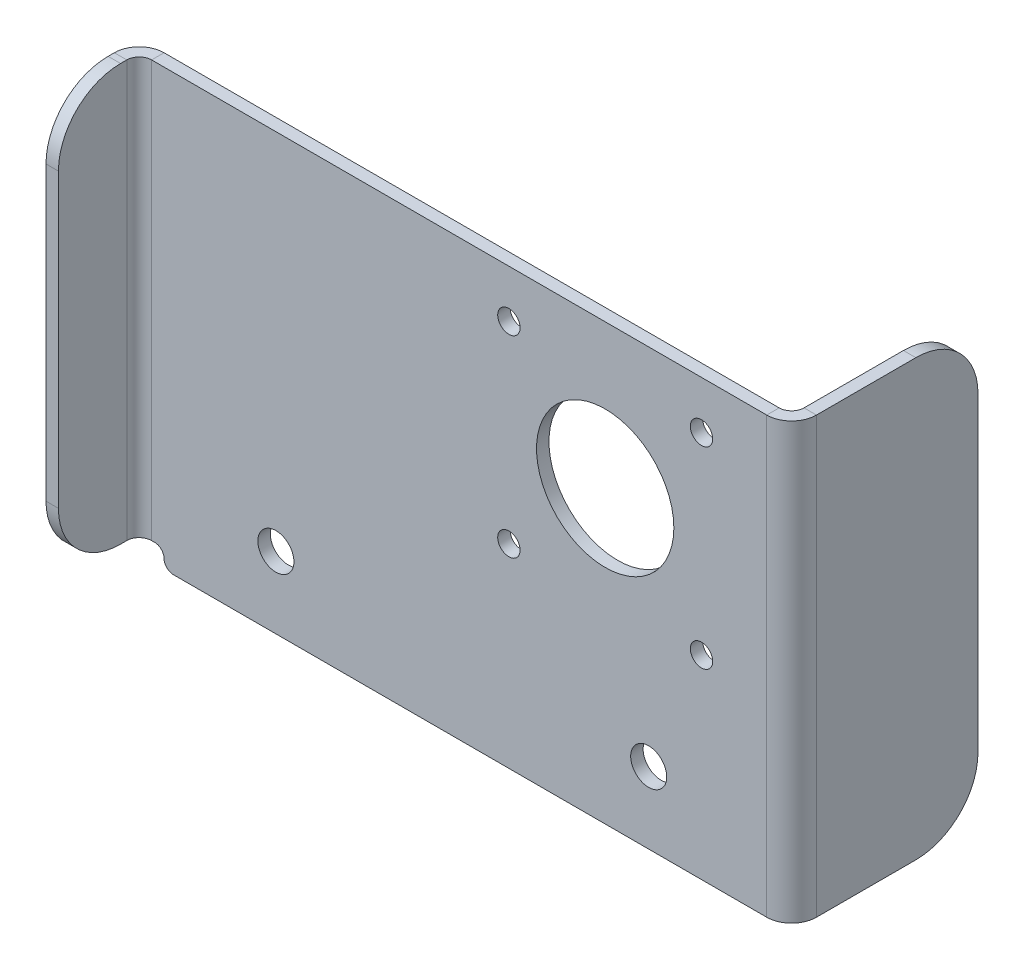
ISO-10303-21;
HEADER;
FILE_DESCRIPTION(('STEP AP214'),'2;1');
FILE_NAME('part.step','',(''),(''),'','','');
FILE_SCHEMA(('AUTOMOTIVE_DESIGN { 1 0 10303 214 1 1 1 1 }'));
ENDSEC;
DATA;
#1=APPLICATION_CONTEXT('core data for automotive mechanical design processes');
#2=APPLICATION_PROTOCOL_DEFINITION('international standard','automotive_design',2000,#1);
#3=PRODUCT_CONTEXT('',#1,'mechanical');
#4=PRODUCT('Part','Part','',(#3));
#5=PRODUCT_RELATED_PRODUCT_CATEGORY('part','',(#4));
#6=PRODUCT_DEFINITION_FORMATION('','',#4);
#7=PRODUCT_DEFINITION_CONTEXT('part definition',#1,'design');
#8=PRODUCT_DEFINITION('design','',#6,#7);
#9=PRODUCT_DEFINITION_SHAPE('','',#8);
#10=(LENGTH_UNIT() NAMED_UNIT(*) SI_UNIT(.MILLI.,.METRE.));
#11=(NAMED_UNIT(*) PLANE_ANGLE_UNIT() SI_UNIT($,.RADIAN.));
#12=(NAMED_UNIT(*) SI_UNIT($,.STERADIAN.) SOLID_ANGLE_UNIT());
#13=UNCERTAINTY_MEASURE_WITH_UNIT(LENGTH_MEASURE(1.E-05),#10,'distance_accuracy_value','');
#14=(GEOMETRIC_REPRESENTATION_CONTEXT(3) GLOBAL_UNCERTAINTY_ASSIGNED_CONTEXT((#13)) GLOBAL_UNIT_ASSIGNED_CONTEXT((#10,
#11,#12)) REPRESENTATION_CONTEXT('',''));
#15=CARTESIAN_POINT('',(0.,0.,0.));
#16=DIRECTION('',(0.,0.,1.));
#17=DIRECTION('',(1.,0.,0.));
#18=AXIS2_PLACEMENT_3D('',#15,#16,#17);
#19=CARTESIAN_POINT('',(-48.,-35.,-2.));
#20=DIRECTION('',(0.,-1.,0.));
#21=DIRECTION('',(0.,0.,-1.));
#22=AXIS2_PLACEMENT_3D('',#19,#20,#21);
#23=PLANE('',#22);
#24=DIRECTION('',(1.,0.,0.));
#25=VECTOR('',#24,1.);
#26=CARTESIAN_POINT('',(-48.,-35.,0.));
#27=LINE('',#26,#25);
#28=CARTESIAN_POINT('',(-46.5,-35.,0.));
#29=VERTEX_POINT('',#28);
#30=CARTESIAN_POINT('',(49.,-35.,0.));
#31=VERTEX_POINT('',#30);
#32=EDGE_CURVE('E442',#29,#31,#27,.T.);
#33=ORIENTED_EDGE('',*,*,#32,.F.);
#34=DIRECTION('',(0.,0.,1.));
#35=VECTOR('',#34,1.);
#36=CARTESIAN_POINT('',(-46.5,-35.,-2.));
#37=LINE('',#36,#35);
#38=CARTESIAN_POINT('',(-46.5,-35.,-2.));
#39=VERTEX_POINT('',#38);
#40=EDGE_CURVE('E111',#29,#39,#37,.F.);
#41=ORIENTED_EDGE('',*,*,#40,.T.);
#42=DIRECTION('',(1.,0.,0.));
#43=VECTOR('',#42,1.);
#44=CARTESIAN_POINT('',(-48.,-35.,-2.));
#45=LINE('',#44,#43);
#46=CARTESIAN_POINT('',(49.,-35.,-2.));
#47=VERTEX_POINT('',#46);
#48=EDGE_CURVE('E441',#39,#47,#45,.T.);
#49=ORIENTED_EDGE('',*,*,#48,.T.);
#50=DIRECTION('',(0.,0.,1.));
#51=VECTOR('',#50,1.);
#52=CARTESIAN_POINT('',(49.,-35.,-2.));
#53=LINE('',#52,#51);
#54=EDGE_CURVE('E288',#47,#31,#53,.T.);
#55=ORIENTED_EDGE('',*,*,#54,.T.);
#56=EDGE_LOOP('',(#33,#41,#49,#55));
#57=FACE_BOUND('',#56,.T.);
#58=ADVANCED_FACE('F86',(#57),#23,.T.);
#59=CARTESIAN_POINT('',(-48.,35.,-2.));
#60=DIRECTION('',(0.,1.,0.));
#61=DIRECTION('',(0.,0.,1.));
#62=AXIS2_PLACEMENT_3D('',#59,#60,#61);
#63=PLANE('',#62);
#64=DIRECTION('',(-1.,0.,0.));
#65=VECTOR('',#64,1.);
#66=CARTESIAN_POINT('',(-48.,35.,0.));
#67=LINE('',#66,#65);
#68=CARTESIAN_POINT('',(49.,35.,0.));
#69=VERTEX_POINT('',#68);
#70=CARTESIAN_POINT('',(-50.,35.,0.));
#71=VERTEX_POINT('',#70);
#72=EDGE_CURVE('E433',#69,#71,#67,.T.);
#73=ORIENTED_EDGE('',*,*,#72,.F.);
#74=DIRECTION('',(0.,0.,1.));
#75=VECTOR('',#74,1.);
#76=CARTESIAN_POINT('',(49.,35.,-2.));
#77=LINE('',#76,#75);
#78=CARTESIAN_POINT('',(49.,35.,-2.));
#79=VERTEX_POINT('',#78);
#80=EDGE_CURVE('E298',#79,#69,#77,.T.);
#81=ORIENTED_EDGE('',*,*,#80,.F.);
#82=DIRECTION('',(-1.,0.,0.));
#83=VECTOR('',#82,1.);
#84=CARTESIAN_POINT('',(-48.,35.,-2.));
#85=LINE('',#84,#83);
#86=CARTESIAN_POINT('',(-50.,35.,-2.));
#87=VERTEX_POINT('',#86);
#88=EDGE_CURVE('E437',#79,#87,#85,.T.);
#89=ORIENTED_EDGE('',*,*,#88,.T.);
#90=DIRECTION('',(0.,0.,-1.));
#91=VECTOR('',#90,1.);
#92=CARTESIAN_POINT('',(-50.,35.,0.));
#93=LINE('',#92,#91);
#94=EDGE_CURVE('E381',#71,#87,#93,.T.);
#95=ORIENTED_EDGE('',*,*,#94,.F.);
#96=EDGE_LOOP('',(#73,#81,#89,#95));
#97=FACE_BOUND('',#96,.T.);
#98=ADVANCED_FACE('F548',(#97),#63,.T.);
#99=CARTESIAN_POINT('',(0.,0.,-2.));
#100=DIRECTION('',(0.,0.,-1.));
#101=DIRECTION('',(-1.,0.,0.));
#102=AXIS2_PLACEMENT_3D('',#99,#100,#101);
#103=PLANE('',#102);
#104=CARTESIAN_POINT('',(30.0000000000026,-23.5000000000008,-2.));
#105=DIRECTION('',(0.,0.,1.));
#106=DIRECTION('',(1.,0.,0.));
#107=AXIS2_PLACEMENT_3D('',#104,#105,#106);
#108=CIRCLE('',#107,2.9);
#109=CARTESIAN_POINT('',(32.9000000000026,-23.5000000000008,-2.));
#110=VERTEX_POINT('',#109);
#111=EDGE_CURVE('E308',#110,#110,#108,.T.);
#112=ORIENTED_EDGE('',*,*,#111,.T.);
#113=EDGE_LOOP('',(#112));
#114=FACE_BOUND('',#113,.T.);
#115=CARTESIAN_POINT('',(-29.9999999999974,-23.500000000001,-2.));
#116=DIRECTION('',(0.,0.,1.));
#117=DIRECTION('',(1.,0.,0.));
#118=AXIS2_PLACEMENT_3D('',#115,#116,#117);
#119=CIRCLE('',#118,2.9);
#120=CARTESIAN_POINT('',(-27.0999999999974,-23.500000000001,-2.));
#121=VERTEX_POINT('',#120);
#122=EDGE_CURVE('E316',#121,#121,#119,.T.);
#123=ORIENTED_EDGE('',*,*,#122,.T.);
#124=EDGE_LOOP('',(#123));
#125=FACE_BOUND('',#124,.T.);
#126=CARTESIAN_POINT('',(38.5000000000025,27.2999999999994,-2.));
#127=DIRECTION('',(0.,0.,1.));
#128=DIRECTION('',(1.,0.,0.));
#129=AXIS2_PLACEMENT_3D('',#126,#127,#128);
#130=CIRCLE('',#129,1.8);
#131=CARTESIAN_POINT('',(40.3000000000025,27.2999999999994,-2.));
#132=VERTEX_POINT('',#131);
#133=EDGE_CURVE('E400',#132,#132,#130,.T.);
#134=ORIENTED_EDGE('',*,*,#133,.T.);
#135=EDGE_LOOP('',(#134));
#136=FACE_BOUND('',#135,.T.);
#137=CARTESIAN_POINT('',(38.5000000000025,-3.70000000000062,-2.));
#138=DIRECTION('',(0.,0.,1.));
#139=DIRECTION('',(1.,0.,0.));
#140=AXIS2_PLACEMENT_3D('',#137,#138,#139);
#141=CIRCLE('',#140,1.8);
#142=CARTESIAN_POINT('',(40.3000000000025,-3.70000000000062,-2.));
#143=VERTEX_POINT('',#142);
#144=EDGE_CURVE('E408',#143,#143,#141,.T.);
#145=ORIENTED_EDGE('',*,*,#144,.T.);
#146=EDGE_LOOP('',(#145));
#147=FACE_BOUND('',#146,.T.);
#148=CARTESIAN_POINT('',(7.50000000000252,27.2999999999994,-2.));
#149=DIRECTION('',(0.,0.,1.));
#150=DIRECTION('',(1.,0.,0.));
#151=AXIS2_PLACEMENT_3D('',#148,#149,#150);
#152=CIRCLE('',#151,1.8);
#153=CARTESIAN_POINT('',(9.30000000000251,27.2999999999994,-2.));
#154=VERTEX_POINT('',#153);
#155=EDGE_CURVE('E416',#154,#154,#152,.T.);
#156=ORIENTED_EDGE('',*,*,#155,.T.);
#157=EDGE_LOOP('',(#156));
#158=FACE_BOUND('',#157,.T.);
#159=CARTESIAN_POINT('',(7.50000000000252,-3.70000000000063,-2.));
#160=DIRECTION('',(0.,0.,1.));
#161=DIRECTION('',(1.,0.,0.));
#162=AXIS2_PLACEMENT_3D('',#159,#160,#161);
#163=CIRCLE('',#162,1.8);
#164=CARTESIAN_POINT('',(9.30000000000251,-3.70000000000063,-2.));
#165=VERTEX_POINT('',#164);
#166=EDGE_CURVE('E424',#165,#165,#163,.T.);
#167=ORIENTED_EDGE('',*,*,#166,.T.);
#168=EDGE_LOOP('',(#167));
#169=FACE_BOUND('',#168,.T.);
#170=CARTESIAN_POINT('',(23.0000000000025,11.7999999999994,-2.));
#171=DIRECTION('',(0.,0.,1.));
#172=DIRECTION('',(1.,0.,0.));
#173=AXIS2_PLACEMENT_3D('',#170,#171,#172);
#174=CIRCLE('',#173,11.05);
#175=CARTESIAN_POINT('',(34.0500000000025,11.7999999999994,-2.));
#176=VERTEX_POINT('',#175);
#177=EDGE_CURVE('E429',#176,#176,#174,.T.);
#178=ORIENTED_EDGE('',*,*,#177,.T.);
#179=EDGE_LOOP('',(#178));
#180=FACE_BOUND('',#179,.T.);
#181=ORIENTED_EDGE('',*,*,#48,.F.);
#182=CARTESIAN_POINT('',(-46.5,-33.5,-2.));
#183=DIRECTION('',(0.,0.,-1.));
#184=DIRECTION('',(-1.,0.,0.));
#185=AXIS2_PLACEMENT_3D('',#182,#183,#184);
#186=CIRCLE('',#185,1.5);
#187=CARTESIAN_POINT('',(-48.,-33.5,-2.));
#188=VERTEX_POINT('',#187);
#189=EDGE_CURVE('E103',#39,#188,#186,.T.);
#190=ORIENTED_EDGE('',*,*,#189,.T.);
#191=CARTESIAN_POINT('',(-49.5,-33.5,-2.));
#192=DIRECTION('',(0.,0.,-1.));
#193=DIRECTION('',(-1.,0.,0.));
#194=AXIS2_PLACEMENT_3D('',#191,#192,#193);
#195=CIRCLE('',#194,1.5);
#196=CARTESIAN_POINT('',(-49.5,-32.,-2.));
#197=VERTEX_POINT('',#196);
#198=EDGE_CURVE('E96',#188,#197,#195,.F.);
#199=ORIENTED_EDGE('',*,*,#198,.T.);
#200=DIRECTION('',(1.,0.,0.));
#201=VECTOR('',#200,1.);
#202=CARTESIAN_POINT('',(-50.,-32.,-2.));
#203=LINE('',#202,#201);
#204=CARTESIAN_POINT('',(-50.,-32.,-2.));
#205=VERTEX_POINT('',#204);
#206=EDGE_CURVE('E385',#205,#197,#203,.T.);
#207=ORIENTED_EDGE('',*,*,#206,.F.);
#208=DIRECTION('',(0.,-1.,0.));
#209=VECTOR('',#208,1.);
#210=CARTESIAN_POINT('',(-50.,-32.,-2.));
#211=LINE('',#210,#209);
#212=EDGE_CURVE('E358',#205,#87,#211,.F.);
#213=ORIENTED_EDGE('',*,*,#212,.T.);
#214=ORIENTED_EDGE('',*,*,#88,.F.);
#215=DIRECTION('',(0.,-1.,0.));
#216=VECTOR('',#215,1.);
#217=CARTESIAN_POINT('',(49.,-35.,-2.));
#218=LINE('',#217,#216);
#219=EDGE_CURVE('E293',#47,#79,#218,.F.);
#220=ORIENTED_EDGE('',*,*,#219,.F.);
#221=EDGE_LOOP('',(#181,#190,#199,#207,#213,#214,#220));
#222=FACE_BOUND('',#221,.T.);
#223=ADVANCED_FACE('F516',(#114,#125,#136,#147,#158,#169,#180,#222),#103,.T.);
#224=CARTESIAN_POINT('',(0.,0.,0.));
#225=DIRECTION('',(0.,0.,-1.));
#226=DIRECTION('',(-1.,0.,0.));
#227=AXIS2_PLACEMENT_3D('',#224,#225,#226);
#228=PLANE('',#227);
#229=CARTESIAN_POINT('',(30.0000000000026,-23.5000000000008,0.));
#230=DIRECTION('',(0.,0.,1.));
#231=DIRECTION('',(1.,0.,0.));
#232=AXIS2_PLACEMENT_3D('',#229,#230,#231);
#233=CIRCLE('',#232,2.9);
#234=CARTESIAN_POINT('',(32.9000000000026,-23.5000000000008,0.));
#235=VERTEX_POINT('',#234);
#236=EDGE_CURVE('E302',#235,#235,#233,.T.);
#237=ORIENTED_EDGE('',*,*,#236,.F.);
#238=EDGE_LOOP('',(#237));
#239=FACE_BOUND('',#238,.T.);
#240=CARTESIAN_POINT('',(-29.9999999999974,-23.500000000001,0.));
#241=DIRECTION('',(0.,0.,1.));
#242=DIRECTION('',(1.,0.,0.));
#243=AXIS2_PLACEMENT_3D('',#240,#241,#242);
#244=CIRCLE('',#243,2.9);
#245=CARTESIAN_POINT('',(-27.0999999999974,-23.500000000001,0.));
#246=VERTEX_POINT('',#245);
#247=EDGE_CURVE('E312',#246,#246,#244,.T.);
#248=ORIENTED_EDGE('',*,*,#247,.F.);
#249=EDGE_LOOP('',(#248));
#250=FACE_BOUND('',#249,.T.);
#251=CARTESIAN_POINT('',(38.5000000000025,27.2999999999994,0.));
#252=DIRECTION('',(0.,0.,1.));
#253=DIRECTION('',(1.,0.,0.));
#254=AXIS2_PLACEMENT_3D('',#251,#252,#253);
#255=CIRCLE('',#254,1.79999999999999);
#256=CARTESIAN_POINT('',(40.3000000000025,27.2999999999994,0.));
#257=VERTEX_POINT('',#256);
#258=EDGE_CURVE('E396',#257,#257,#255,.T.);
#259=ORIENTED_EDGE('',*,*,#258,.F.);
#260=EDGE_LOOP('',(#259));
#261=FACE_BOUND('',#260,.T.);
#262=CARTESIAN_POINT('',(38.5000000000025,-3.70000000000062,0.));
#263=DIRECTION('',(0.,0.,1.));
#264=DIRECTION('',(1.,0.,0.));
#265=AXIS2_PLACEMENT_3D('',#262,#263,#264);
#266=CIRCLE('',#265,1.79999999999999);
#267=CARTESIAN_POINT('',(40.3000000000025,-3.70000000000062,0.));
#268=VERTEX_POINT('',#267);
#269=EDGE_CURVE('E404',#268,#268,#266,.T.);
#270=ORIENTED_EDGE('',*,*,#269,.F.);
#271=EDGE_LOOP('',(#270));
#272=FACE_BOUND('',#271,.T.);
#273=CARTESIAN_POINT('',(7.50000000000252,27.2999999999994,0.));
#274=DIRECTION('',(0.,0.,1.));
#275=DIRECTION('',(1.,0.,0.));
#276=AXIS2_PLACEMENT_3D('',#273,#274,#275);
#277=CIRCLE('',#276,1.79999999999999);
#278=CARTESIAN_POINT('',(9.3000000000025,27.2999999999994,0.));
#279=VERTEX_POINT('',#278);
#280=EDGE_CURVE('E412',#279,#279,#277,.T.);
#281=ORIENTED_EDGE('',*,*,#280,.F.);
#282=EDGE_LOOP('',(#281));
#283=FACE_BOUND('',#282,.T.);
#284=CARTESIAN_POINT('',(7.50000000000252,-3.70000000000063,0.));
#285=DIRECTION('',(0.,0.,1.));
#286=DIRECTION('',(1.,0.,0.));
#287=AXIS2_PLACEMENT_3D('',#284,#285,#286);
#288=CIRCLE('',#287,1.79999999999999);
#289=CARTESIAN_POINT('',(9.3000000000025,-3.70000000000063,0.));
#290=VERTEX_POINT('',#289);
#291=EDGE_CURVE('E420',#290,#290,#288,.T.);
#292=ORIENTED_EDGE('',*,*,#291,.F.);
#293=EDGE_LOOP('',(#292));
#294=FACE_BOUND('',#293,.T.);
#295=CARTESIAN_POINT('',(23.0000000000025,11.7999999999994,0.));
#296=DIRECTION('',(0.,0.,1.));
#297=DIRECTION('',(1.,0.,0.));
#298=AXIS2_PLACEMENT_3D('',#295,#296,#297);
#299=CIRCLE('',#298,11.05);
#300=CARTESIAN_POINT('',(34.0500000000025,11.7999999999994,0.));
#301=VERTEX_POINT('',#300);
#302=EDGE_CURVE('E428',#301,#301,#299,.T.);
#303=ORIENTED_EDGE('',*,*,#302,.F.);
#304=EDGE_LOOP('',(#303));
#305=FACE_BOUND('',#304,.T.);
#306=DIRECTION('',(1.,0.,0.));
#307=VECTOR('',#306,1.);
#308=CARTESIAN_POINT('',(-50.,-32.,0.));
#309=LINE('',#308,#307);
#310=CARTESIAN_POINT('',(-50.,-32.,0.));
#311=VERTEX_POINT('',#310);
#312=CARTESIAN_POINT('',(-49.5,-32.,0.));
#313=VERTEX_POINT('',#312);
#314=EDGE_CURVE('E392',#311,#313,#309,.T.);
#315=ORIENTED_EDGE('',*,*,#314,.T.);
#316=CARTESIAN_POINT('',(-49.5,-33.5,0.));
#317=DIRECTION('',(0.,0.,-1.));
#318=DIRECTION('',(-1.,0.,0.));
#319=AXIS2_PLACEMENT_3D('',#316,#317,#318);
#320=CIRCLE('',#319,1.5);
#321=CARTESIAN_POINT('',(-48.,-33.5,0.));
#322=VERTEX_POINT('',#321);
#323=EDGE_CURVE('E13',#313,#322,#320,.T.);
#324=ORIENTED_EDGE('',*,*,#323,.T.);
#325=CARTESIAN_POINT('',(-46.5,-33.5,0.));
#326=DIRECTION('',(0.,0.,-1.));
#327=DIRECTION('',(-1.,0.,0.));
#328=AXIS2_PLACEMENT_3D('',#325,#326,#327);
#329=CIRCLE('',#328,1.5);
#330=EDGE_CURVE('E505',#322,#29,#329,.F.);
#331=ORIENTED_EDGE('',*,*,#330,.T.);
#332=ORIENTED_EDGE('',*,*,#32,.T.);
#333=DIRECTION('',(0.,-1.,0.));
#334=VECTOR('',#333,1.);
#335=CARTESIAN_POINT('',(49.,-35.,0.));
#336=LINE('',#335,#334);
#337=EDGE_CURVE('E227',#31,#69,#336,.F.);
#338=ORIENTED_EDGE('',*,*,#337,.T.);
#339=ORIENTED_EDGE('',*,*,#72,.T.);
#340=DIRECTION('',(0.,-1.,0.));
#341=VECTOR('',#340,1.);
#342=CARTESIAN_POINT('',(-50.,-32.,0.));
#343=LINE('',#342,#341);
#344=EDGE_CURVE('E375',#311,#71,#343,.F.);
#345=ORIENTED_EDGE('',*,*,#344,.F.);
#346=EDGE_LOOP('',(#315,#324,#331,#332,#338,#339,#345));
#347=FACE_BOUND('',#346,.T.);
#348=ADVANCED_FACE('F526',(#239,#250,#261,#272,#283,#294,#305,#347),#228,.F.);
#349=CARTESIAN_POINT('',(23.0000000000025,11.7999999999994,-2.));
#350=DIRECTION('',(0.,0.,1.));
#351=DIRECTION('',(1.,0.,0.));
#352=AXIS2_PLACEMENT_3D('',#349,#350,#351);
#353=CYLINDRICAL_SURFACE('',#352,11.05);
#354=ORIENTED_EDGE('',*,*,#177,.F.);
#355=EDGE_LOOP('',(#354));
#356=FACE_BOUND('',#355,.T.);
#357=ORIENTED_EDGE('',*,*,#302,.T.);
#358=EDGE_LOOP('',(#357));
#359=FACE_BOUND('',#358,.T.);
#360=ADVANCED_FACE('F743',(#356,#359),#353,.F.);
#361=CARTESIAN_POINT('',(7.50000000000252,-3.70000000000063,0.));
#362=DIRECTION('',(0.,0.,1.));
#363=DIRECTION('',(1.,0.,0.));
#364=AXIS2_PLACEMENT_3D('',#361,#362,#363);
#365=CYLINDRICAL_SURFACE('',#364,1.79999999999999);
#366=ORIENTED_EDGE('',*,*,#166,.F.);
#367=EDGE_LOOP('',(#366));
#368=FACE_BOUND('',#367,.T.);
#369=ORIENTED_EDGE('',*,*,#291,.T.);
#370=EDGE_LOOP('',(#369));
#371=FACE_BOUND('',#370,.T.);
#372=ADVANCED_FACE('F739',(#368,#371),#365,.F.);
#373=CARTESIAN_POINT('',(7.50000000000252,27.2999999999994,0.));
#374=DIRECTION('',(0.,0.,1.));
#375=DIRECTION('',(1.,0.,0.));
#376=AXIS2_PLACEMENT_3D('',#373,#374,#375);
#377=CYLINDRICAL_SURFACE('',#376,1.79999999999999);
#378=ORIENTED_EDGE('',*,*,#155,.F.);
#379=EDGE_LOOP('',(#378));
#380=FACE_BOUND('',#379,.T.);
#381=ORIENTED_EDGE('',*,*,#280,.T.);
#382=EDGE_LOOP('',(#381));
#383=FACE_BOUND('',#382,.T.);
#384=ADVANCED_FACE('F735',(#380,#383),#377,.F.);
#385=CARTESIAN_POINT('',(38.5000000000025,-3.70000000000062,0.));
#386=DIRECTION('',(0.,0.,1.));
#387=DIRECTION('',(1.,0.,0.));
#388=AXIS2_PLACEMENT_3D('',#385,#386,#387);
#389=CYLINDRICAL_SURFACE('',#388,1.79999999999999);
#390=ORIENTED_EDGE('',*,*,#144,.F.);
#391=EDGE_LOOP('',(#390));
#392=FACE_BOUND('',#391,.T.);
#393=ORIENTED_EDGE('',*,*,#269,.T.);
#394=EDGE_LOOP('',(#393));
#395=FACE_BOUND('',#394,.T.);
#396=ADVANCED_FACE('F731',(#392,#395),#389,.F.);
#397=CARTESIAN_POINT('',(38.5000000000025,27.2999999999994,0.));
#398=DIRECTION('',(0.,0.,1.));
#399=DIRECTION('',(1.,0.,0.));
#400=AXIS2_PLACEMENT_3D('',#397,#398,#399);
#401=CYLINDRICAL_SURFACE('',#400,1.79999999999999);
#402=ORIENTED_EDGE('',*,*,#133,.F.);
#403=EDGE_LOOP('',(#402));
#404=FACE_BOUND('',#403,.T.);
#405=ORIENTED_EDGE('',*,*,#258,.T.);
#406=EDGE_LOOP('',(#405));
#407=FACE_BOUND('',#406,.T.);
#408=ADVANCED_FACE('F728',(#404,#407),#401,.F.);
#409=CARTESIAN_POINT('',(-50.,-32.,0.));
#410=DIRECTION('',(0.,-1.,0.));
#411=DIRECTION('',(0.,0.,-1.));
#412=AXIS2_PLACEMENT_3D('',#409,#410,#411);
#413=PLANE('',#412);
#414=ORIENTED_EDGE('',*,*,#206,.T.);
#415=DIRECTION('',(0.,0.,-1.));
#416=VECTOR('',#415,1.);
#417=CARTESIAN_POINT('',(-49.5,-32.,0.));
#418=LINE('',#417,#416);
#419=EDGE_CURVE('E501',#197,#313,#418,.F.);
#420=ORIENTED_EDGE('',*,*,#419,.T.);
#421=ORIENTED_EDGE('',*,*,#314,.F.);
#422=DIRECTION('',(0.,0.,-1.));
#423=VECTOR('',#422,1.);
#424=CARTESIAN_POINT('',(-50.,-32.,0.));
#425=LINE('',#424,#423);
#426=EDGE_CURVE('E367',#311,#205,#425,.T.);
#427=ORIENTED_EDGE('',*,*,#426,.T.);
#428=EDGE_LOOP('',(#414,#420,#421,#427));
#429=FACE_BOUND('',#428,.T.);
#430=ADVANCED_FACE('F521',(#429),#413,.T.);
#431=CARTESIAN_POINT('',(-50.,35.,2.));
#432=DIRECTION('',(0.,1.,0.));
#433=DIRECTION('',(0.,0.,1.));
#434=AXIS2_PLACEMENT_3D('',#431,#432,#433);
#435=PLANE('',#434);
#436=DIRECTION('',(1.,0.,0.));
#437=VECTOR('',#436,1.);
#438=CARTESIAN_POINT('',(-54.,35.,1.99999999999999));
#439=LINE('',#438,#437);
#440=CARTESIAN_POINT('',(-52.,35.,1.99999999999999));
#441=VERTEX_POINT('',#440);
#442=CARTESIAN_POINT('',(-54.,35.,1.99999999999999));
#443=VERTEX_POINT('',#442);
#444=EDGE_CURVE('E320',#441,#443,#439,.F.);
#445=ORIENTED_EDGE('',*,*,#444,.F.);
#446=CARTESIAN_POINT('',(-50.,35.,2.));
#447=DIRECTION('',(0.,-1.,0.));
#448=DIRECTION('',(0.,0.,-1.));
#449=AXIS2_PLACEMENT_3D('',#446,#447,#448);
#450=CIRCLE('',#449,2.);
#451=EDGE_CURVE('E371',#71,#441,#450,.F.);
#452=ORIENTED_EDGE('',*,*,#451,.F.);
#453=ORIENTED_EDGE('',*,*,#94,.T.);
#454=CARTESIAN_POINT('',(-50.,35.,2.));
#455=DIRECTION('',(0.,-1.,0.));
#456=DIRECTION('',(0.,0.,-1.));
#457=AXIS2_PLACEMENT_3D('',#454,#455,#456);
#458=CIRCLE('',#457,4.);
#459=EDGE_CURVE('E362',#87,#443,#458,.F.);
#460=ORIENTED_EDGE('',*,*,#459,.T.);
#461=EDGE_LOOP('',(#445,#452,#453,#460));
#462=FACE_BOUND('',#461,.T.);
#463=ADVANCED_FACE('F719',(#462),#435,.T.);
#464=CARTESIAN_POINT('',(-50.,-32.,2.));
#465=DIRECTION('',(0.,1.,0.));
#466=DIRECTION('',(0.,0.,1.));
#467=AXIS2_PLACEMENT_3D('',#464,#465,#466);
#468=PLANE('',#467);
#469=CARTESIAN_POINT('',(-50.,-32.,2.));
#470=DIRECTION('',(0.,-1.,0.));
#471=DIRECTION('',(0.,0.,-1.));
#472=AXIS2_PLACEMENT_3D('',#469,#470,#471);
#473=CIRCLE('',#472,2.);
#474=CARTESIAN_POINT('',(-52.,-32.,1.99999999999999));
#475=VERTEX_POINT('',#474);
#476=EDGE_CURVE('E325',#475,#311,#473,.T.);
#477=ORIENTED_EDGE('',*,*,#476,.F.);
#478=DIRECTION('',(1.,0.,0.));
#479=VECTOR('',#478,1.);
#480=CARTESIAN_POINT('',(-52.,-32.,1.99999999999999));
#481=LINE('',#480,#479);
#482=CARTESIAN_POINT('',(-54.,-32.,1.99999999999999));
#483=VERTEX_POINT('',#482);
#484=EDGE_CURVE('E348',#475,#483,#481,.F.);
#485=ORIENTED_EDGE('',*,*,#484,.T.);
#486=CARTESIAN_POINT('',(-50.,-32.,2.));
#487=DIRECTION('',(0.,-1.,0.));
#488=DIRECTION('',(0.,0.,-1.));
#489=AXIS2_PLACEMENT_3D('',#486,#487,#488);
#490=CIRCLE('',#489,4.);
#491=EDGE_CURVE('E363',#483,#205,#490,.T.);
#492=ORIENTED_EDGE('',*,*,#491,.T.);
#493=ORIENTED_EDGE('',*,*,#426,.F.);
#494=EDGE_LOOP('',(#477,#485,#492,#493));
#495=FACE_BOUND('',#494,.T.);
#496=ADVANCED_FACE('F714',(#495),#468,.F.);
#497=CARTESIAN_POINT('',(-50.,-32.,2.));
#498=DIRECTION('',(0.,-1.,0.));
#499=DIRECTION('',(-1.,0.,0.));
#500=AXIS2_PLACEMENT_3D('',#497,#498,#499);
#501=CYLINDRICAL_SURFACE('',#500,4.);
#502=ORIENTED_EDGE('',*,*,#212,.F.);
#503=ORIENTED_EDGE('',*,*,#491,.F.);
#504=DIRECTION('',(0.,-1.,0.));
#505=VECTOR('',#504,1.);
#506=CARTESIAN_POINT('',(-54.,35.,1.99999999999999));
#507=LINE('',#506,#505);
#508=EDGE_CURVE('E344',#483,#443,#507,.F.);
#509=ORIENTED_EDGE('',*,*,#508,.T.);
#510=ORIENTED_EDGE('',*,*,#459,.F.);
#511=EDGE_LOOP('',(#502,#503,#509,#510));
#512=FACE_BOUND('',#511,.T.);
#513=ADVANCED_FACE('F711',(#512),#501,.T.);
#514=CARTESIAN_POINT('',(-50.,-32.,2.));
#515=DIRECTION('',(0.,-1.,0.));
#516=DIRECTION('',(-1.,0.,0.));
#517=AXIS2_PLACEMENT_3D('',#514,#515,#516);
#518=CYLINDRICAL_SURFACE('',#517,2.);
#519=ORIENTED_EDGE('',*,*,#344,.T.);
#520=ORIENTED_EDGE('',*,*,#451,.T.);
#521=DIRECTION('',(0.,-1.,0.));
#522=VECTOR('',#521,1.);
#523=CARTESIAN_POINT('',(-52.,35.,1.99999999999999));
#524=LINE('',#523,#522);
#525=EDGE_CURVE('E352',#441,#475,#524,.T.);
#526=ORIENTED_EDGE('',*,*,#525,.T.);
#527=ORIENTED_EDGE('',*,*,#476,.T.);
#528=EDGE_LOOP('',(#519,#520,#526,#527));
#529=FACE_BOUND('',#528,.T.);
#530=ADVANCED_FACE('F709',(#529),#518,.F.);
#531=CARTESIAN_POINT('',(-54.,35.,0.));
#532=DIRECTION('',(0.,-1.,0.));
#533=DIRECTION('',(0.,0.,-1.));
#534=AXIS2_PLACEMENT_3D('',#531,#532,#533);
#535=PLANE('',#534);
#536=DIRECTION('',(0.,0.,-1.));
#537=VECTOR('',#536,1.);
#538=CARTESIAN_POINT('',(-54.,35.,-1.86326682040211E-13));
#539=LINE('',#538,#537);
#540=CARTESIAN_POINT('',(-54.,35.,3.));
#541=VERTEX_POINT('',#540);
#542=EDGE_CURVE('E330',#541,#443,#539,.T.);
#543=ORIENTED_EDGE('',*,*,#542,.F.);
#544=DIRECTION('',(1.,0.,0.));
#545=VECTOR('',#544,1.);
#546=CARTESIAN_POINT('',(-54.,35.,3.));
#547=LINE('',#546,#545);
#548=CARTESIAN_POINT('',(-52.,35.,3.00000000000001));
#549=VERTEX_POINT('',#548);
#550=EDGE_CURVE('E472',#541,#549,#547,.T.);
#551=ORIENTED_EDGE('',*,*,#550,.T.);
#552=DIRECTION('',(0.,0.,1.));
#553=VECTOR('',#552,1.);
#554=CARTESIAN_POINT('',(-52.,35.,0.));
#555=LINE('',#554,#553);
#556=EDGE_CURVE('E341',#549,#441,#555,.F.);
#557=ORIENTED_EDGE('',*,*,#556,.T.);
#558=ORIENTED_EDGE('',*,*,#444,.T.);
#559=EDGE_LOOP('',(#543,#551,#557,#558));
#560=FACE_BOUND('',#559,.T.);
#561=ADVANCED_FACE('F705',(#560),#535,.F.);
#562=CARTESIAN_POINT('',(-54.,-32.,13.));
#563=DIRECTION('',(0.,1.,0.));
#564=DIRECTION('',(0.,0.,1.));
#565=AXIS2_PLACEMENT_3D('',#562,#563,#564);
#566=PLANE('',#565);
#567=DIRECTION('',(0.,0.,-1.));
#568=VECTOR('',#567,1.);
#569=CARTESIAN_POINT('',(-52.,-32.,13.));
#570=LINE('',#569,#568);
#571=CARTESIAN_POINT('',(-52.,-32.,3.00000000000001));
#572=VERTEX_POINT('',#571);
#573=EDGE_CURVE('E337',#475,#572,#570,.F.);
#574=ORIENTED_EDGE('',*,*,#573,.T.);
#575=DIRECTION('',(1.,0.,0.));
#576=VECTOR('',#575,1.);
#577=CARTESIAN_POINT('',(-54.,-32.,3.));
#578=LINE('',#577,#576);
#579=CARTESIAN_POINT('',(-54.,-32.,3.));
#580=VERTEX_POINT('',#579);
#581=EDGE_CURVE('E463',#572,#580,#578,.F.);
#582=ORIENTED_EDGE('',*,*,#581,.T.);
#583=DIRECTION('',(0.,0.,1.));
#584=VECTOR('',#583,1.);
#585=CARTESIAN_POINT('',(-54.,-32.,-1.86326682040211E-13));
#586=LINE('',#585,#584);
#587=EDGE_CURVE('E326',#483,#580,#586,.T.);
#588=ORIENTED_EDGE('',*,*,#587,.F.);
#589=ORIENTED_EDGE('',*,*,#484,.F.);
#590=EDGE_LOOP('',(#574,#582,#588,#589));
#591=FACE_BOUND('',#590,.T.);
#592=ADVANCED_FACE('F695',(#591),#566,.F.);
#593=CARTESIAN_POINT('',(-54.,0.,-1.86326682040211E-13));
#594=DIRECTION('',(1.,0.,0.));
#595=DIRECTION('',(0.,0.,-1.));
#596=AXIS2_PLACEMENT_3D('',#593,#594,#595);
#597=PLANE('',#596);
#598=ORIENTED_EDGE('',*,*,#587,.T.);
#599=CARTESIAN_POINT('',(-54.,-22.,3.));
#600=DIRECTION('',(1.,0.,0.));
#601=DIRECTION('',(0.,0.,-1.));
#602=AXIS2_PLACEMENT_3D('',#599,#600,#601);
#603=CIRCLE('',#602,10.);
#604=CARTESIAN_POINT('',(-54.,-22.,13.));
#605=VERTEX_POINT('',#604);
#606=EDGE_CURVE('E469',#580,#605,#603,.F.);
#607=ORIENTED_EDGE('',*,*,#606,.T.);
#608=DIRECTION('',(0.,1.,0.));
#609=VECTOR('',#608,1.);
#610=CARTESIAN_POINT('',(-54.,0.,13.));
#611=LINE('',#610,#609);
#612=CARTESIAN_POINT('',(-54.,25.,13.));
#613=VERTEX_POINT('',#612);
#614=EDGE_CURVE('E321',#605,#613,#611,.T.);
#615=ORIENTED_EDGE('',*,*,#614,.T.);
#616=CARTESIAN_POINT('',(-54.,25.,3.));
#617=DIRECTION('',(1.,0.,0.));
#618=DIRECTION('',(0.,0.,-1.));
#619=AXIS2_PLACEMENT_3D('',#616,#617,#618);
#620=CIRCLE('',#619,10.);
#621=EDGE_CURVE('E466',#613,#541,#620,.F.);
#622=ORIENTED_EDGE('',*,*,#621,.T.);
#623=ORIENTED_EDGE('',*,*,#542,.T.);
#624=ORIENTED_EDGE('',*,*,#508,.F.);
#625=EDGE_LOOP('',(#598,#607,#615,#622,#623,#624));
#626=FACE_BOUND('',#625,.T.);
#627=ADVANCED_FACE('F691',(#626),#597,.F.);
#628=CARTESIAN_POINT('',(-52.,0.,-1.79343719362525E-13));
#629=DIRECTION('',(1.,0.,0.));
#630=DIRECTION('',(0.,0.,-1.));
#631=AXIS2_PLACEMENT_3D('',#628,#629,#630);
#632=PLANE('',#631);
#633=DIRECTION('',(0.,-1.,0.));
#634=VECTOR('',#633,1.);
#635=CARTESIAN_POINT('',(-52.,35.,13.));
#636=LINE('',#635,#634);
#637=CARTESIAN_POINT('',(-52.,-22.,13.));
#638=VERTEX_POINT('',#637);
#639=CARTESIAN_POINT('',(-52.,25.,13.));
#640=VERTEX_POINT('',#639);
#641=EDGE_CURVE('E333',#638,#640,#636,.F.);
#642=ORIENTED_EDGE('',*,*,#641,.F.);
#643=CARTESIAN_POINT('',(-52.,-22.,3.00000000000001));
#644=DIRECTION('',(1.,0.,0.));
#645=DIRECTION('',(0.,0.,-1.));
#646=AXIS2_PLACEMENT_3D('',#643,#644,#645);
#647=CIRCLE('',#646,10.);
#648=EDGE_CURVE('E460',#638,#572,#647,.T.);
#649=ORIENTED_EDGE('',*,*,#648,.T.);
#650=ORIENTED_EDGE('',*,*,#573,.F.);
#651=ORIENTED_EDGE('',*,*,#525,.F.);
#652=ORIENTED_EDGE('',*,*,#556,.F.);
#653=CARTESIAN_POINT('',(-52.,25.,3.00000000000001));
#654=DIRECTION('',(1.,0.,0.));
#655=DIRECTION('',(0.,0.,-1.));
#656=AXIS2_PLACEMENT_3D('',#653,#654,#655);
#657=CIRCLE('',#656,10.);
#658=EDGE_CURVE('E457',#549,#640,#657,.T.);
#659=ORIENTED_EDGE('',*,*,#658,.T.);
#660=EDGE_LOOP('',(#642,#649,#650,#651,#652,#659));
#661=FACE_BOUND('',#660,.T.);
#662=ADVANCED_FACE('F694',(#661),#632,.T.);
#663=CARTESIAN_POINT('',(-54.,35.,13.));
#664=DIRECTION('',(0.,0.,-1.));
#665=DIRECTION('',(-1.,0.,0.));
#666=AXIS2_PLACEMENT_3D('',#663,#664,#665);
#667=PLANE('',#666);
#668=ORIENTED_EDGE('',*,*,#614,.F.);
#669=DIRECTION('',(1.,0.,0.));
#670=VECTOR('',#669,1.);
#671=CARTESIAN_POINT('',(-54.,-22.,13.));
#672=LINE('',#671,#670);
#673=EDGE_CURVE('E453',#605,#638,#672,.T.);
#674=ORIENTED_EDGE('',*,*,#673,.T.);
#675=ORIENTED_EDGE('',*,*,#641,.T.);
#676=DIRECTION('',(1.,0.,0.));
#677=VECTOR('',#676,1.);
#678=CARTESIAN_POINT('',(-54.,25.,13.));
#679=LINE('',#678,#677);
#680=EDGE_CURVE('E445',#640,#613,#679,.F.);
#681=ORIENTED_EDGE('',*,*,#680,.T.);
#682=EDGE_LOOP('',(#668,#674,#675,#681));
#683=FACE_BOUND('',#682,.T.);
#684=ADVANCED_FACE('F689',(#683),#667,.F.);
#685=CARTESIAN_POINT('',(-29.9999999999974,-23.500000000001,0.));
#686=DIRECTION('',(0.,0.,1.));
#687=DIRECTION('',(1.,0.,0.));
#688=AXIS2_PLACEMENT_3D('',#685,#686,#687);
#689=CYLINDRICAL_SURFACE('',#688,2.9);
#690=ORIENTED_EDGE('',*,*,#122,.F.);
#691=EDGE_LOOP('',(#690));
#692=FACE_BOUND('',#691,.T.);
#693=ORIENTED_EDGE('',*,*,#247,.T.);
#694=EDGE_LOOP('',(#693));
#695=FACE_BOUND('',#694,.T.);
#696=ADVANCED_FACE('F685',(#692,#695),#689,.F.);
#697=CARTESIAN_POINT('',(30.0000000000026,-23.5000000000008,0.));
#698=DIRECTION('',(0.,0.,1.));
#699=DIRECTION('',(1.,0.,0.));
#700=AXIS2_PLACEMENT_3D('',#697,#698,#699);
#701=CYLINDRICAL_SURFACE('',#700,2.9);
#702=ORIENTED_EDGE('',*,*,#111,.F.);
#703=EDGE_LOOP('',(#702));
#704=FACE_BOUND('',#703,.T.);
#705=ORIENTED_EDGE('',*,*,#236,.T.);
#706=EDGE_LOOP('',(#705));
#707=FACE_BOUND('',#706,.T.);
#708=ADVANCED_FACE('F680',(#704,#707),#701,.F.);
#709=CARTESIAN_POINT('',(49.,35.,-4.));
#710=DIRECTION('',(0.,1.,0.));
#711=DIRECTION('',(0.,0.,1.));
#712=AXIS2_PLACEMENT_3D('',#709,#710,#711);
#713=PLANE('',#712);
#714=DIRECTION('',(-1.,0.,0.));
#715=VECTOR('',#714,1.);
#716=CARTESIAN_POINT('',(53.,35.,-3.99999999999999));
#717=LINE('',#716,#715);
#718=CARTESIAN_POINT('',(51.,35.,-4.));
#719=VERTEX_POINT('',#718);
#720=CARTESIAN_POINT('',(53.,35.,-3.99999999999999));
#721=VERTEX_POINT('',#720);
#722=EDGE_CURVE('E280',#719,#721,#717,.F.);
#723=ORIENTED_EDGE('',*,*,#722,.F.);
#724=CARTESIAN_POINT('',(49.,35.,-4.));
#725=DIRECTION('',(0.,-1.,0.));
#726=DIRECTION('',(0.,0.,-1.));
#727=AXIS2_PLACEMENT_3D('',#724,#725,#726);
#728=CIRCLE('',#727,2.);
#729=EDGE_CURVE('E232',#79,#719,#728,.F.);
#730=ORIENTED_EDGE('',*,*,#729,.F.);
#731=ORIENTED_EDGE('',*,*,#80,.T.);
#732=CARTESIAN_POINT('',(49.,35.,-4.));
#733=DIRECTION('',(0.,-1.,0.));
#734=DIRECTION('',(0.,0.,-1.));
#735=AXIS2_PLACEMENT_3D('',#732,#733,#734);
#736=CIRCLE('',#735,4.);
#737=EDGE_CURVE('E286',#69,#721,#736,.F.);
#738=ORIENTED_EDGE('',*,*,#737,.T.);
#739=EDGE_LOOP('',(#723,#730,#731,#738));
#740=FACE_BOUND('',#739,.T.);
#741=ADVANCED_FACE('F653',(#740),#713,.T.);
#742=CARTESIAN_POINT('',(49.,-35.,-4.));
#743=DIRECTION('',(0.,1.,0.));
#744=DIRECTION('',(0.,0.,1.));
#745=AXIS2_PLACEMENT_3D('',#742,#743,#744);
#746=PLANE('',#745);
#747=CARTESIAN_POINT('',(49.,-35.,-4.));
#748=DIRECTION('',(0.,-1.,0.));
#749=DIRECTION('',(0.,0.,-1.));
#750=AXIS2_PLACEMENT_3D('',#747,#748,#749);
#751=CIRCLE('',#750,2.);
#752=CARTESIAN_POINT('',(51.,-35.,-4.));
#753=VERTEX_POINT('',#752);
#754=EDGE_CURVE('E239',#753,#47,#751,.T.);
#755=ORIENTED_EDGE('',*,*,#754,.F.);
#756=DIRECTION('',(-1.,0.,0.));
#757=VECTOR('',#756,1.);
#758=CARTESIAN_POINT('',(51.,-35.,-4.));
#759=LINE('',#758,#757);
#760=CARTESIAN_POINT('',(53.,-35.,-3.99999999999999));
#761=VERTEX_POINT('',#760);
#762=EDGE_CURVE('E236',#753,#761,#759,.F.);
#763=ORIENTED_EDGE('',*,*,#762,.T.);
#764=CARTESIAN_POINT('',(49.,-35.,-4.));
#765=DIRECTION('',(0.,-1.,0.));
#766=DIRECTION('',(0.,0.,-1.));
#767=AXIS2_PLACEMENT_3D('',#764,#765,#766);
#768=CIRCLE('',#767,4.);
#769=EDGE_CURVE('E220',#761,#31,#768,.T.);
#770=ORIENTED_EDGE('',*,*,#769,.T.);
#771=ORIENTED_EDGE('',*,*,#54,.F.);
#772=EDGE_LOOP('',(#755,#763,#770,#771));
#773=FACE_BOUND('',#772,.T.);
#774=ADVANCED_FACE('F237',(#773),#746,.F.);
#775=CARTESIAN_POINT('',(49.,-35.,-4.));
#776=DIRECTION('',(0.,-1.,0.));
#777=DIRECTION('',(1.,0.,0.));
#778=AXIS2_PLACEMENT_3D('',#775,#776,#777);
#779=CYLINDRICAL_SURFACE('',#778,4.);
#780=ORIENTED_EDGE('',*,*,#337,.F.);
#781=ORIENTED_EDGE('',*,*,#769,.F.);
#782=DIRECTION('',(0.,-1.,0.));
#783=VECTOR('',#782,1.);
#784=CARTESIAN_POINT('',(53.,35.,-3.99999999999999));
#785=LINE('',#784,#783);
#786=EDGE_CURVE('E224',#761,#721,#785,.F.);
#787=ORIENTED_EDGE('',*,*,#786,.T.);
#788=ORIENTED_EDGE('',*,*,#737,.F.);
#789=EDGE_LOOP('',(#780,#781,#787,#788));
#790=FACE_BOUND('',#789,.T.);
#791=ADVANCED_FACE('F222',(#790),#779,.T.);
#792=CARTESIAN_POINT('',(49.,-35.,-4.));
#793=DIRECTION('',(0.,-1.,0.));
#794=DIRECTION('',(1.,0.,0.));
#795=AXIS2_PLACEMENT_3D('',#792,#793,#794);
#796=CYLINDRICAL_SURFACE('',#795,2.);
#797=ORIENTED_EDGE('',*,*,#219,.T.);
#798=ORIENTED_EDGE('',*,*,#729,.T.);
#799=DIRECTION('',(0.,-1.,0.));
#800=VECTOR('',#799,1.);
#801=CARTESIAN_POINT('',(51.,35.,-4.));
#802=LINE('',#801,#800);
#803=EDGE_CURVE('E245',#719,#753,#802,.T.);
#804=ORIENTED_EDGE('',*,*,#803,.T.);
#805=ORIENTED_EDGE('',*,*,#754,.T.);
#806=EDGE_LOOP('',(#797,#798,#804,#805));
#807=FACE_BOUND('',#806,.T.);
#808=ADVANCED_FACE('F657',(#807),#796,.F.);
#809=CARTESIAN_POINT('',(53.0000000000001,-35.,-30.));
#810=DIRECTION('',(0.,1.,0.));
#811=DIRECTION('',(0.,0.,1.));
#812=AXIS2_PLACEMENT_3D('',#809,#810,#811);
#813=PLANE('',#812);
#814=DIRECTION('',(0.,0.,1.));
#815=VECTOR('',#814,1.);
#816=CARTESIAN_POINT('',(51.0000000000001,-35.,-30.));
#817=LINE('',#816,#815);
#818=CARTESIAN_POINT('',(51.,-35.,-20.));
#819=VERTEX_POINT('',#818);
#820=EDGE_CURVE('E255',#753,#819,#817,.F.);
#821=ORIENTED_EDGE('',*,*,#820,.T.);
#822=DIRECTION('',(-1.,0.,0.));
#823=VECTOR('',#822,1.);
#824=CARTESIAN_POINT('',(53.0000000000001,-35.,-20.));
#825=LINE('',#824,#823);
#826=CARTESIAN_POINT('',(53.0000000000001,-35.,-20.));
#827=VERTEX_POINT('',#826);
#828=EDGE_CURVE('E259',#819,#827,#825,.F.);
#829=ORIENTED_EDGE('',*,*,#828,.T.);
#830=DIRECTION('',(0.,0.,-1.));
#831=VECTOR('',#830,1.);
#832=CARTESIAN_POINT('',(53.,-35.,1.7351641637146E-13));
#833=LINE('',#832,#831);
#834=EDGE_CURVE('E250',#761,#827,#833,.T.);
#835=ORIENTED_EDGE('',*,*,#834,.F.);
#836=ORIENTED_EDGE('',*,*,#762,.F.);
#837=EDGE_LOOP('',(#821,#829,#835,#836));
#838=FACE_BOUND('',#837,.T.);
#839=ADVANCED_FACE('F257',(#838),#813,.F.);
#840=CARTESIAN_POINT('',(53.,35.,-1.99999999999999));
#841=DIRECTION('',(0.,-1.,0.));
#842=DIRECTION('',(0.,0.,-1.));
#843=AXIS2_PLACEMENT_3D('',#840,#841,#842);
#844=PLANE('',#843);
#845=DIRECTION('',(0.,0.,1.));
#846=VECTOR('',#845,1.);
#847=CARTESIAN_POINT('',(53.,35.,1.7351641637146E-13));
#848=LINE('',#847,#846);
#849=CARTESIAN_POINT('',(53.0000000000001,35.,-20.));
#850=VERTEX_POINT('',#849);
#851=EDGE_CURVE('E253',#850,#721,#848,.T.);
#852=ORIENTED_EDGE('',*,*,#851,.F.);
#853=DIRECTION('',(-1.,0.,0.));
#854=VECTOR('',#853,1.);
#855=CARTESIAN_POINT('',(53.0000000000001,35.,-20.));
#856=LINE('',#855,#854);
#857=CARTESIAN_POINT('',(51.,35.,-20.));
#858=VERTEX_POINT('',#857);
#859=EDGE_CURVE('E497',#850,#858,#856,.T.);
#860=ORIENTED_EDGE('',*,*,#859,.T.);
#861=DIRECTION('',(0.,0.,-1.));
#862=VECTOR('',#861,1.);
#863=CARTESIAN_POINT('',(51.,35.,-2.));
#864=LINE('',#863,#862);
#865=EDGE_CURVE('E262',#858,#719,#864,.F.);
#866=ORIENTED_EDGE('',*,*,#865,.T.);
#867=ORIENTED_EDGE('',*,*,#722,.T.);
#868=EDGE_LOOP('',(#852,#860,#866,#867));
#869=FACE_BOUND('',#868,.T.);
#870=ADVANCED_FACE('F579',(#869),#844,.F.);
#871=CARTESIAN_POINT('',(53.,0.,1.7351641637146E-13));
#872=DIRECTION('',(-1.,0.,0.));
#873=DIRECTION('',(0.,0.,1.));
#874=AXIS2_PLACEMENT_3D('',#871,#872,#873);
#875=PLANE('',#874);
#876=ORIENTED_EDGE('',*,*,#834,.T.);
#877=CARTESIAN_POINT('',(53.0000000000001,-25.,-20.));
#878=DIRECTION('',(-1.,0.,0.));
#879=DIRECTION('',(0.,0.,1.));
#880=AXIS2_PLACEMENT_3D('',#877,#878,#879);
#881=CIRCLE('',#880,10.);
#882=CARTESIAN_POINT('',(53.0000000000001,-25.,-30.));
#883=VERTEX_POINT('',#882);
#884=EDGE_CURVE('E494',#827,#883,#881,.F.);
#885=ORIENTED_EDGE('',*,*,#884,.T.);
#886=DIRECTION('',(0.,1.,0.));
#887=VECTOR('',#886,1.);
#888=CARTESIAN_POINT('',(53.0000000000001,0.,-30.));
#889=LINE('',#888,#887);
#890=CARTESIAN_POINT('',(53.0000000000001,25.,-30.));
#891=VERTEX_POINT('',#890);
#892=EDGE_CURVE('E261',#883,#891,#889,.T.);
#893=ORIENTED_EDGE('',*,*,#892,.T.);
#894=CARTESIAN_POINT('',(53.0000000000001,25.,-20.));
#895=DIRECTION('',(-1.,0.,0.));
#896=DIRECTION('',(0.,0.,1.));
#897=AXIS2_PLACEMENT_3D('',#894,#895,#896);
#898=CIRCLE('',#897,10.);
#899=EDGE_CURVE('E491',#891,#850,#898,.F.);
#900=ORIENTED_EDGE('',*,*,#899,.T.);
#901=ORIENTED_EDGE('',*,*,#851,.T.);
#902=ORIENTED_EDGE('',*,*,#786,.F.);
#903=EDGE_LOOP('',(#876,#885,#893,#900,#901,#902));
#904=FACE_BOUND('',#903,.T.);
#905=ADVANCED_FACE('F249',(#904),#875,.F.);
#906=CARTESIAN_POINT('',(51.,0.,1.66533453693773E-13));
#907=DIRECTION('',(-1.,0.,0.));
#908=DIRECTION('',(0.,0.,1.));
#909=AXIS2_PLACEMENT_3D('',#906,#907,#908);
#910=PLANE('',#909);
#911=DIRECTION('',(0.,-1.,0.));
#912=VECTOR('',#911,1.);
#913=CARTESIAN_POINT('',(51.0000000000001,35.,-30.));
#914=LINE('',#913,#912);
#915=CARTESIAN_POINT('',(51.0000000000001,-25.,-30.));
#916=VERTEX_POINT('',#915);
#917=CARTESIAN_POINT('',(51.0000000000001,25.,-30.));
#918=VERTEX_POINT('',#917);
#919=EDGE_CURVE('E269',#916,#918,#914,.F.);
#920=ORIENTED_EDGE('',*,*,#919,.F.);
#921=CARTESIAN_POINT('',(51.,-25.,-20.));
#922=DIRECTION('',(-1.,0.,0.));
#923=DIRECTION('',(0.,0.,1.));
#924=AXIS2_PLACEMENT_3D('',#921,#922,#923);
#925=CIRCLE('',#924,10.);
#926=EDGE_CURVE('E486',#916,#819,#925,.T.);
#927=ORIENTED_EDGE('',*,*,#926,.T.);
#928=ORIENTED_EDGE('',*,*,#820,.F.);
#929=ORIENTED_EDGE('',*,*,#803,.F.);
#930=ORIENTED_EDGE('',*,*,#865,.F.);
#931=CARTESIAN_POINT('',(51.,25.,-20.));
#932=DIRECTION('',(-1.,0.,0.));
#933=DIRECTION('',(0.,0.,1.));
#934=AXIS2_PLACEMENT_3D('',#931,#932,#933);
#935=CIRCLE('',#934,10.);
#936=EDGE_CURVE('E483',#858,#918,#935,.T.);
#937=ORIENTED_EDGE('',*,*,#936,.T.);
#938=EDGE_LOOP('',(#920,#927,#928,#929,#930,#937));
#939=FACE_BOUND('',#938,.T.);
#940=ADVANCED_FACE('F660',(#939),#910,.T.);
#941=CARTESIAN_POINT('',(53.0000000000001,35.,-30.));
#942=DIRECTION('',(0.,0.,1.));
#943=DIRECTION('',(1.,0.,0.));
#944=AXIS2_PLACEMENT_3D('',#941,#942,#943);
#945=PLANE('',#944);
#946=ORIENTED_EDGE('',*,*,#892,.F.);
#947=DIRECTION('',(-1.,0.,0.));
#948=VECTOR('',#947,1.);
#949=CARTESIAN_POINT('',(53.0000000000001,-25.,-30.));
#950=LINE('',#949,#948);
#951=EDGE_CURVE('E479',#883,#916,#950,.T.);
#952=ORIENTED_EDGE('',*,*,#951,.T.);
#953=ORIENTED_EDGE('',*,*,#919,.T.);
#954=DIRECTION('',(-1.,0.,0.));
#955=VECTOR('',#954,1.);
#956=CARTESIAN_POINT('',(53.0000000000001,25.,-30.));
#957=LINE('',#956,#955);
#958=EDGE_CURVE('E476',#918,#891,#957,.F.);
#959=ORIENTED_EDGE('',*,*,#958,.T.);
#960=EDGE_LOOP('',(#946,#952,#953,#959));
#961=FACE_BOUND('',#960,.T.);
#962=ADVANCED_FACE('F562',(#961),#945,.F.);
#963=CARTESIAN_POINT('',(-54.,-22.,3.));
#964=DIRECTION('',(1.,0.,0.));
#965=DIRECTION('',(0.,0.,-1.));
#966=AXIS2_PLACEMENT_3D('',#963,#964,#965);
#967=CYLINDRICAL_SURFACE('',#966,10.);
#968=ORIENTED_EDGE('',*,*,#606,.F.);
#969=ORIENTED_EDGE('',*,*,#581,.F.);
#970=ORIENTED_EDGE('',*,*,#648,.F.);
#971=ORIENTED_EDGE('',*,*,#673,.F.);
#972=EDGE_LOOP('',(#968,#969,#970,#971));
#973=FACE_BOUND('',#972,.T.);
#974=ADVANCED_FACE('F558',(#973),#967,.T.);
#975=CARTESIAN_POINT('',(-54.,25.,3.));
#976=DIRECTION('',(1.,0.,0.));
#977=DIRECTION('',(0.,0.,-1.));
#978=AXIS2_PLACEMENT_3D('',#975,#976,#977);
#979=CYLINDRICAL_SURFACE('',#978,10.);
#980=ORIENTED_EDGE('',*,*,#621,.F.);
#981=ORIENTED_EDGE('',*,*,#680,.F.);
#982=ORIENTED_EDGE('',*,*,#658,.F.);
#983=ORIENTED_EDGE('',*,*,#550,.F.);
#984=EDGE_LOOP('',(#980,#981,#982,#983));
#985=FACE_BOUND('',#984,.T.);
#986=ADVANCED_FACE('F561',(#985),#979,.T.);
#987=CARTESIAN_POINT('',(53.0000000000001,-25.,-20.));
#988=DIRECTION('',(-1.,0.,0.));
#989=DIRECTION('',(0.,0.,1.));
#990=AXIS2_PLACEMENT_3D('',#987,#988,#989);
#991=CYLINDRICAL_SURFACE('',#990,10.);
#992=ORIENTED_EDGE('',*,*,#884,.F.);
#993=ORIENTED_EDGE('',*,*,#828,.F.);
#994=ORIENTED_EDGE('',*,*,#926,.F.);
#995=ORIENTED_EDGE('',*,*,#951,.F.);
#996=EDGE_LOOP('',(#992,#993,#994,#995));
#997=FACE_BOUND('',#996,.T.);
#998=ADVANCED_FACE('F544',(#997),#991,.T.);
#999=CARTESIAN_POINT('',(53.0000000000001,25.,-20.));
#1000=DIRECTION('',(-1.,0.,0.));
#1001=DIRECTION('',(0.,0.,1.));
#1002=AXIS2_PLACEMENT_3D('',#999,#1000,#1001);
#1003=CYLINDRICAL_SURFACE('',#1002,10.);
#1004=ORIENTED_EDGE('',*,*,#899,.F.);
#1005=ORIENTED_EDGE('',*,*,#958,.F.);
#1006=ORIENTED_EDGE('',*,*,#936,.F.);
#1007=ORIENTED_EDGE('',*,*,#859,.F.);
#1008=EDGE_LOOP('',(#1004,#1005,#1006,#1007));
#1009=FACE_BOUND('',#1008,.T.);
#1010=ADVANCED_FACE('F539',(#1009),#1003,.T.);
#1011=CARTESIAN_POINT('',(-46.5,-33.5,-2.));
#1012=DIRECTION('',(0.,0.,1.));
#1013=DIRECTION('',(1.,0.,0.));
#1014=AXIS2_PLACEMENT_3D('',#1011,#1012,#1013);
#1015=CYLINDRICAL_SURFACE('',#1014,1.5);
#1016=ORIENTED_EDGE('',*,*,#40,.F.);
#1017=ORIENTED_EDGE('',*,*,#330,.F.);
#1018=DIRECTION('',(0.,0.,1.));
#1019=VECTOR('',#1018,1.);
#1020=CARTESIAN_POINT('',(-48.,-33.5,-2.));
#1021=LINE('',#1020,#1019);
#1022=EDGE_CURVE('E90',#188,#322,#1021,.T.);
#1023=ORIENTED_EDGE('',*,*,#1022,.F.);
#1024=ORIENTED_EDGE('',*,*,#189,.F.);
#1025=EDGE_LOOP('',(#1016,#1017,#1023,#1024));
#1026=FACE_BOUND('',#1025,.T.);
#1027=ADVANCED_FACE('F88',(#1026),#1015,.T.);
#1028=CARTESIAN_POINT('',(-49.5,-33.5,-2.));
#1029=DIRECTION('',(0.,0.,1.));
#1030=DIRECTION('',(1.,0.,0.));
#1031=AXIS2_PLACEMENT_3D('',#1028,#1029,#1030);
#1032=CYLINDRICAL_SURFACE('',#1031,1.5);
#1033=ORIENTED_EDGE('',*,*,#323,.F.);
#1034=ORIENTED_EDGE('',*,*,#419,.F.);
#1035=ORIENTED_EDGE('',*,*,#198,.F.);
#1036=ORIENTED_EDGE('',*,*,#1022,.T.);
#1037=EDGE_LOOP('',(#1033,#1034,#1035,#1036));
#1038=FACE_BOUND('',#1037,.T.);
#1039=ADVANCED_FACE('F523',(#1038),#1032,.F.);
#1040=CLOSED_SHELL('',(#58,#98,#223,#348,#360,#372,#384,#396,#408,#430,#463,#496,#513,#530,#561,
#592,#627,#662,#684,#696,#708,#741,#774,#791,#808,#839,#870,#905,#940,#962,#974,#986,#998,#1010,
#1027,#1039));
#1041=MANIFOLD_SOLID_BREP('B2',#1040);
#1042=ADVANCED_BREP_SHAPE_REPRESENTATION('',(#18,#1041),#14);
#1043=SHAPE_DEFINITION_REPRESENTATION(#9,#1042);
ENDSEC;
END-ISO-10303-21;
